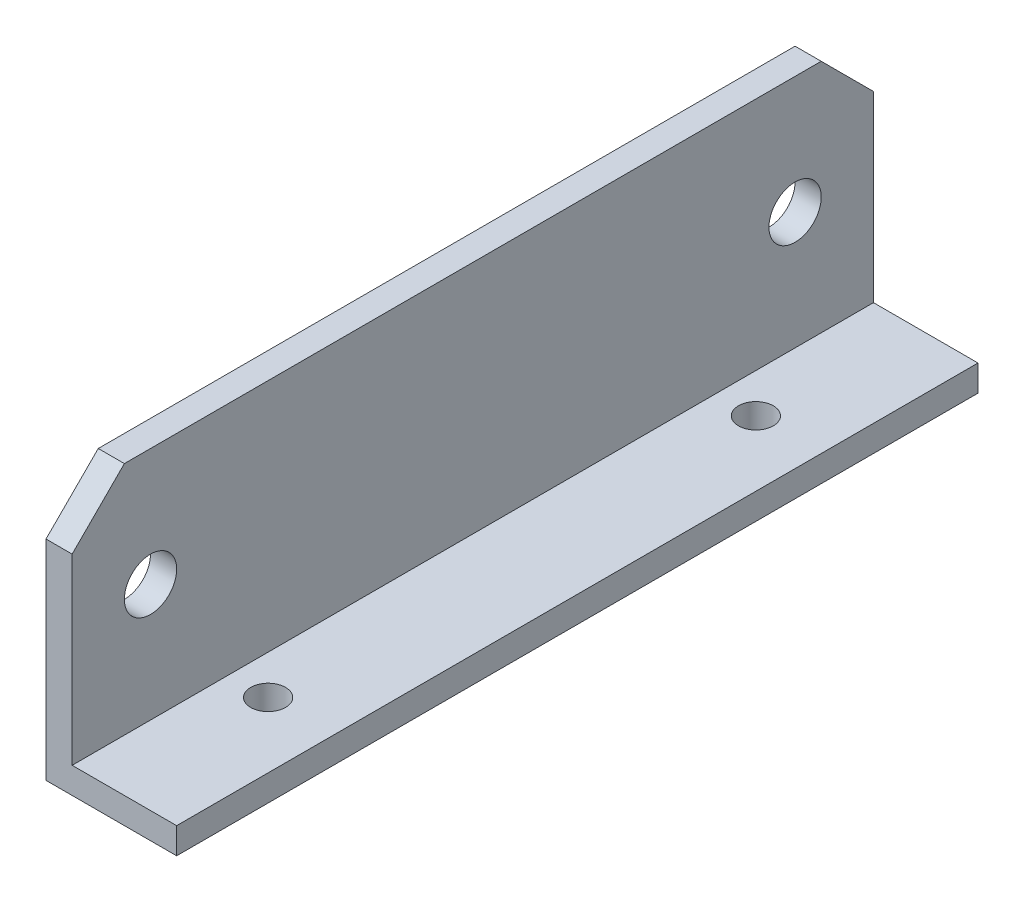
ISO-10303-21;
HEADER;
FILE_DESCRIPTION(('STEP AP214'),'2;1');
FILE_NAME('part.step','',(''),(''),'','','');
FILE_SCHEMA(('AUTOMOTIVE_DESIGN { 1 0 10303 214 1 1 1 1 }'));
ENDSEC;
DATA;
#1=APPLICATION_CONTEXT('core data for automotive mechanical design processes');
#2=APPLICATION_PROTOCOL_DEFINITION('international standard','automotive_design',2000,#1);
#3=PRODUCT_CONTEXT('',#1,'mechanical');
#4=PRODUCT('Part','Part','',(#3));
#5=PRODUCT_RELATED_PRODUCT_CATEGORY('part','',(#4));
#6=PRODUCT_DEFINITION_FORMATION('','',#4);
#7=PRODUCT_DEFINITION_CONTEXT('part definition',#1,'design');
#8=PRODUCT_DEFINITION('design','',#6,#7);
#9=PRODUCT_DEFINITION_SHAPE('','',#8);
#10=(LENGTH_UNIT() NAMED_UNIT(*) SI_UNIT(.MILLI.,.METRE.));
#11=(NAMED_UNIT(*) PLANE_ANGLE_UNIT() SI_UNIT($,.RADIAN.));
#12=(NAMED_UNIT(*) SI_UNIT($,.STERADIAN.) SOLID_ANGLE_UNIT());
#13=UNCERTAINTY_MEASURE_WITH_UNIT(LENGTH_MEASURE(1.E-05),#10,'distance_accuracy_value','');
#14=(GEOMETRIC_REPRESENTATION_CONTEXT(3) GLOBAL_UNCERTAINTY_ASSIGNED_CONTEXT((#13)) GLOBAL_UNIT_ASSIGNED_CONTEXT((#10,
#11,#12)) REPRESENTATION_CONTEXT('',''));
#15=CARTESIAN_POINT('',(0.,0.,0.));
#16=DIRECTION('',(0.,0.,1.));
#17=DIRECTION('',(1.,0.,0.));
#18=AXIS2_PLACEMENT_3D('',#15,#16,#17);
#19=CARTESIAN_POINT('',(1.5,0.,46.));
#20=DIRECTION('',(-1.,0.,0.));
#21=DIRECTION('',(0.,0.,1.));
#22=AXIS2_PLACEMENT_3D('',#19,#20,#21);
#23=PLANE('',#22);
#24=CARTESIAN_POINT('',(1.5,8.25,4.5));
#25=DIRECTION('',(-1.,0.,0.));
#26=DIRECTION('',(0.,0.,1.));
#27=AXIS2_PLACEMENT_3D('',#24,#25,#26);
#28=CIRCLE('',#27,1.5);
#29=CARTESIAN_POINT('',(1.5,8.25,6.00000000000001));
#30=VERTEX_POINT('',#29);
#31=EDGE_CURVE('E203',#30,#30,#28,.T.);
#32=ORIENTED_EDGE('',*,*,#31,.T.);
#33=EDGE_LOOP('',(#32));
#34=FACE_BOUND('',#33,.T.);
#35=CARTESIAN_POINT('',(1.5,8.25,41.5));
#36=DIRECTION('',(-1.,0.,0.));
#37=DIRECTION('',(0.,0.,1.));
#38=AXIS2_PLACEMENT_3D('',#35,#36,#37);
#39=CIRCLE('',#38,1.5);
#40=CARTESIAN_POINT('',(1.5,8.25,43.));
#41=VERTEX_POINT('',#40);
#42=EDGE_CURVE('E206',#41,#41,#39,.T.);
#43=ORIENTED_EDGE('',*,*,#42,.T.);
#44=EDGE_LOOP('',(#43));
#45=FACE_BOUND('',#44,.T.);
#46=DIRECTION('',(0.,0.,-1.));
#47=VECTOR('',#46,1.);
#48=CARTESIAN_POINT('',(1.5,15.,46.));
#49=LINE('',#48,#47);
#50=CARTESIAN_POINT('',(1.5,15.,43.));
#51=VERTEX_POINT('',#50);
#52=CARTESIAN_POINT('',(1.5,15.,3.));
#53=VERTEX_POINT('',#52);
#54=EDGE_CURVE('E118',#51,#53,#49,.T.);
#55=ORIENTED_EDGE('',*,*,#54,.F.);
#56=DIRECTION('',(0.,-0.707106781186548,0.707106781186547));
#57=VECTOR('',#56,1.);
#58=CARTESIAN_POINT('',(1.5,5.99999999999999,52.));
#59=LINE('',#58,#57);
#60=CARTESIAN_POINT('',(1.5,12.,46.));
#61=VERTEX_POINT('',#60);
#62=EDGE_CURVE('E100',#51,#61,#59,.T.);
#63=ORIENTED_EDGE('',*,*,#62,.T.);
#64=DIRECTION('',(0.,1.,0.));
#65=VECTOR('',#64,1.);
#66=CARTESIAN_POINT('',(1.5,0.,46.));
#67=LINE('',#66,#65);
#68=CARTESIAN_POINT('',(1.5,1.5,46.));
#69=VERTEX_POINT('',#68);
#70=EDGE_CURVE('E150',#69,#61,#67,.T.);
#71=ORIENTED_EDGE('',*,*,#70,.F.);
#72=DIRECTION('',(0.,0.,-1.));
#73=VECTOR('',#72,1.);
#74=CARTESIAN_POINT('',(1.5,1.5,46.));
#75=LINE('',#74,#73);
#76=CARTESIAN_POINT('',(1.5,1.5,0.));
#77=VERTEX_POINT('',#76);
#78=EDGE_CURVE('E151',#69,#77,#75,.T.);
#79=ORIENTED_EDGE('',*,*,#78,.T.);
#80=DIRECTION('',(0.,1.,0.));
#81=VECTOR('',#80,1.);
#82=CARTESIAN_POINT('',(1.5,0.,0.));
#83=LINE('',#82,#81);
#84=CARTESIAN_POINT('',(1.5,12.,0.));
#85=VERTEX_POINT('',#84);
#86=EDGE_CURVE('E139',#77,#85,#83,.T.);
#87=ORIENTED_EDGE('',*,*,#86,.T.);
#88=DIRECTION('',(0.,0.707106781186547,0.707106781186548));
#89=VECTOR('',#88,1.);
#90=CARTESIAN_POINT('',(1.5,29.,17.));
#91=LINE('',#90,#89);
#92=EDGE_CURVE('E56',#85,#53,#91,.T.);
#93=ORIENTED_EDGE('',*,*,#92,.T.);
#94=EDGE_LOOP('',(#55,#63,#71,#79,#87,#93));
#95=FACE_BOUND('',#94,.T.);
#96=ADVANCED_FACE('F35',(#34,#45,#95),#23,.F.);
#97=CARTESIAN_POINT('',(0.,15.,46.));
#98=DIRECTION('',(0.,1.,0.));
#99=DIRECTION('',(0.,0.,1.));
#100=AXIS2_PLACEMENT_3D('',#97,#98,#99);
#101=PLANE('',#100);
#102=DIRECTION('',(-1.,0.,0.));
#103=VECTOR('',#102,1.);
#104=CARTESIAN_POINT('',(7.5,15.,43.));
#105=LINE('',#104,#103);
#106=CARTESIAN_POINT('',(0.,15.,43.));
#107=VERTEX_POINT('',#106);
#108=EDGE_CURVE('E97',#51,#107,#105,.T.);
#109=ORIENTED_EDGE('',*,*,#108,.F.);
#110=ORIENTED_EDGE('',*,*,#54,.T.);
#111=DIRECTION('',(-1.,0.,0.));
#112=VECTOR('',#111,1.);
#113=CARTESIAN_POINT('',(7.5,15.,3.));
#114=LINE('',#113,#112);
#115=CARTESIAN_POINT('',(0.,15.,3.));
#116=VERTEX_POINT('',#115);
#117=EDGE_CURVE('E117',#53,#116,#114,.T.);
#118=ORIENTED_EDGE('',*,*,#117,.T.);
#119=DIRECTION('',(0.,0.,-1.));
#120=VECTOR('',#119,1.);
#121=CARTESIAN_POINT('',(0.,15.,46.));
#122=LINE('',#121,#120);
#123=EDGE_CURVE('E110',#107,#116,#122,.T.);
#124=ORIENTED_EDGE('',*,*,#123,.F.);
#125=EDGE_LOOP('',(#109,#110,#118,#124));
#126=FACE_BOUND('',#125,.T.);
#127=ADVANCED_FACE('F116',(#126),#101,.T.);
#128=CARTESIAN_POINT('',(0.,0.,46.));
#129=DIRECTION('',(-1.,0.,0.));
#130=DIRECTION('',(0.,0.,1.));
#131=AXIS2_PLACEMENT_3D('',#128,#129,#130);
#132=PLANE('',#131);
#133=DIRECTION('',(0.,-0.707106781186548,0.707106781186547));
#134=VECTOR('',#133,1.);
#135=CARTESIAN_POINT('',(0.,12.,46.));
#136=LINE('',#135,#134);
#137=CARTESIAN_POINT('',(0.,12.,46.));
#138=VERTEX_POINT('',#137);
#139=EDGE_CURVE('E49',#107,#138,#136,.T.);
#140=ORIENTED_EDGE('',*,*,#139,.F.);
#141=ORIENTED_EDGE('',*,*,#123,.T.);
#142=DIRECTION('',(0.,0.707106781186547,0.707106781186548));
#143=VECTOR('',#142,1.);
#144=CARTESIAN_POINT('',(0.,12.,0.));
#145=LINE('',#144,#143);
#146=CARTESIAN_POINT('',(0.,12.,0.));
#147=VERTEX_POINT('',#146);
#148=EDGE_CURVE('E126',#147,#116,#145,.T.);
#149=ORIENTED_EDGE('',*,*,#148,.F.);
#150=DIRECTION('',(0.,1.,0.));
#151=VECTOR('',#150,1.);
#152=CARTESIAN_POINT('',(0.,0.,0.));
#153=LINE('',#152,#151);
#154=CARTESIAN_POINT('',(0.,0.,0.));
#155=VERTEX_POINT('',#154);
#156=EDGE_CURVE('E132',#155,#147,#153,.T.);
#157=ORIENTED_EDGE('',*,*,#156,.F.);
#158=DIRECTION('',(0.,0.,-1.));
#159=VECTOR('',#158,1.);
#160=CARTESIAN_POINT('',(0.,0.,46.));
#161=LINE('',#160,#159);
#162=CARTESIAN_POINT('',(0.,0.,46.));
#163=VERTEX_POINT('',#162);
#164=EDGE_CURVE('E119',#163,#155,#161,.T.);
#165=ORIENTED_EDGE('',*,*,#164,.F.);
#166=DIRECTION('',(0.,1.,0.));
#167=VECTOR('',#166,1.);
#168=CARTESIAN_POINT('',(0.,0.,46.));
#169=LINE('',#168,#167);
#170=EDGE_CURVE('E113',#163,#138,#169,.T.);
#171=ORIENTED_EDGE('',*,*,#170,.T.);
#172=EDGE_LOOP('',(#140,#141,#149,#157,#165,#171));
#173=FACE_BOUND('',#172,.T.);
#174=CARTESIAN_POINT('',(0.,8.25,4.5));
#175=DIRECTION('',(-1.,0.,0.));
#176=DIRECTION('',(0.,0.,-1.));
#177=AXIS2_PLACEMENT_3D('',#174,#175,#176);
#178=CIRCLE('',#177,1.5);
#179=CARTESIAN_POINT('',(0.,8.25,3.));
#180=VERTEX_POINT('',#179);
#181=EDGE_CURVE('E337',#180,#180,#178,.T.);
#182=ORIENTED_EDGE('',*,*,#181,.F.);
#183=EDGE_LOOP('',(#182));
#184=FACE_BOUND('',#183,.T.);
#185=CARTESIAN_POINT('',(0.,8.25,41.5));
#186=DIRECTION('',(-1.,0.,0.));
#187=DIRECTION('',(0.,0.,1.));
#188=AXIS2_PLACEMENT_3D('',#185,#186,#187);
#189=CIRCLE('',#188,1.5);
#190=CARTESIAN_POINT('',(0.,8.25,43.));
#191=VERTEX_POINT('',#190);
#192=EDGE_CURVE('E209',#191,#191,#189,.T.);
#193=ORIENTED_EDGE('',*,*,#192,.F.);
#194=EDGE_LOOP('',(#193));
#195=FACE_BOUND('',#194,.T.);
#196=ADVANCED_FACE('F107',(#173,#184,#195),#132,.T.);
#197=CARTESIAN_POINT('',(0.,0.,46.));
#198=DIRECTION('',(0.,-1.,0.));
#199=DIRECTION('',(0.,0.,-1.));
#200=AXIS2_PLACEMENT_3D('',#197,#198,#199);
#201=PLANE('',#200);
#202=CARTESIAN_POINT('',(3.75,0.,37.));
#203=DIRECTION('',(0.,1.,0.));
#204=DIRECTION('',(0.,0.,-1.));
#205=AXIS2_PLACEMENT_3D('',#202,#203,#204);
#206=CIRCLE('',#205,1.);
#207=CARTESIAN_POINT('',(3.75,0.,36.));
#208=VERTEX_POINT('',#207);
#209=EDGE_CURVE('E212',#208,#208,#206,.T.);
#210=ORIENTED_EDGE('',*,*,#209,.T.);
#211=EDGE_LOOP('',(#210));
#212=FACE_BOUND('',#211,.T.);
#213=CARTESIAN_POINT('',(3.75,0.,9.));
#214=DIRECTION('',(0.,1.,0.));
#215=DIRECTION('',(0.,0.,1.));
#216=AXIS2_PLACEMENT_3D('',#213,#214,#215);
#217=CIRCLE('',#216,1.);
#218=CARTESIAN_POINT('',(3.75,0.,10.));
#219=VERTEX_POINT('',#218);
#220=EDGE_CURVE('E143',#219,#219,#217,.T.);
#221=ORIENTED_EDGE('',*,*,#220,.T.);
#222=EDGE_LOOP('',(#221));
#223=FACE_BOUND('',#222,.T.);
#224=DIRECTION('',(-1.,0.,0.));
#225=VECTOR('',#224,1.);
#226=CARTESIAN_POINT('',(0.,0.,0.));
#227=LINE('',#226,#225);
#228=CARTESIAN_POINT('',(7.5,0.,0.));
#229=VERTEX_POINT('',#228);
#230=EDGE_CURVE('E138',#229,#155,#227,.T.);
#231=ORIENTED_EDGE('',*,*,#230,.F.);
#232=DIRECTION('',(0.,0.,-1.));
#233=VECTOR('',#232,1.);
#234=CARTESIAN_POINT('',(7.5,0.,46.));
#235=LINE('',#234,#233);
#236=CARTESIAN_POINT('',(7.5,0.,46.));
#237=VERTEX_POINT('',#236);
#238=EDGE_CURVE('E122',#237,#229,#235,.T.);
#239=ORIENTED_EDGE('',*,*,#238,.F.);
#240=DIRECTION('',(-1.,0.,0.));
#241=VECTOR('',#240,1.);
#242=CARTESIAN_POINT('',(0.,0.,46.));
#243=LINE('',#242,#241);
#244=EDGE_CURVE('E176',#237,#163,#243,.T.);
#245=ORIENTED_EDGE('',*,*,#244,.T.);
#246=ORIENTED_EDGE('',*,*,#164,.T.);
#247=EDGE_LOOP('',(#231,#239,#245,#246));
#248=FACE_BOUND('',#247,.T.);
#249=ADVANCED_FACE('F165',(#212,#223,#248),#201,.T.);
#250=CARTESIAN_POINT('',(7.5,1.5,46.));
#251=DIRECTION('',(1.,0.,0.));
#252=DIRECTION('',(0.,0.,-1.));
#253=AXIS2_PLACEMENT_3D('',#250,#251,#252);
#254=PLANE('',#253);
#255=DIRECTION('',(0.,-1.,0.));
#256=VECTOR('',#255,1.);
#257=CARTESIAN_POINT('',(7.5,1.5,0.));
#258=LINE('',#257,#256);
#259=CARTESIAN_POINT('',(7.5,1.5,0.));
#260=VERTEX_POINT('',#259);
#261=EDGE_CURVE('E141',#260,#229,#258,.T.);
#262=ORIENTED_EDGE('',*,*,#261,.F.);
#263=DIRECTION('',(0.,0.,-1.));
#264=VECTOR('',#263,1.);
#265=CARTESIAN_POINT('',(7.5,1.5,46.));
#266=LINE('',#265,#264);
#267=CARTESIAN_POINT('',(7.5,1.5,46.));
#268=VERTEX_POINT('',#267);
#269=EDGE_CURVE('E154',#268,#260,#266,.T.);
#270=ORIENTED_EDGE('',*,*,#269,.F.);
#271=DIRECTION('',(0.,-1.,0.));
#272=VECTOR('',#271,1.);
#273=CARTESIAN_POINT('',(7.5,1.5,46.));
#274=LINE('',#273,#272);
#275=EDGE_CURVE('E161',#268,#237,#274,.T.);
#276=ORIENTED_EDGE('',*,*,#275,.T.);
#277=ORIENTED_EDGE('',*,*,#238,.T.);
#278=EDGE_LOOP('',(#262,#270,#276,#277));
#279=FACE_BOUND('',#278,.T.);
#280=ADVANCED_FACE('F159',(#279),#254,.T.);
#281=CARTESIAN_POINT('',(0.,1.5,46.));
#282=DIRECTION('',(0.,-1.,0.));
#283=DIRECTION('',(0.,0.,-1.));
#284=AXIS2_PLACEMENT_3D('',#281,#282,#283);
#285=PLANE('',#284);
#286=CARTESIAN_POINT('',(3.75,1.5,37.));
#287=DIRECTION('',(0.,1.,0.));
#288=DIRECTION('',(0.,0.,-1.));
#289=AXIS2_PLACEMENT_3D('',#286,#287,#288);
#290=CIRCLE('',#289,1.);
#291=CARTESIAN_POINT('',(3.75,1.5,36.));
#292=VERTEX_POINT('',#291);
#293=EDGE_CURVE('E208',#292,#292,#290,.T.);
#294=ORIENTED_EDGE('',*,*,#293,.F.);
#295=EDGE_LOOP('',(#294));
#296=FACE_BOUND('',#295,.T.);
#297=CARTESIAN_POINT('',(3.75,1.5,9.));
#298=DIRECTION('',(0.,1.,0.));
#299=DIRECTION('',(0.,0.,1.));
#300=AXIS2_PLACEMENT_3D('',#297,#298,#299);
#301=CIRCLE('',#300,1.);
#302=CARTESIAN_POINT('',(3.75,1.5,10.));
#303=VERTEX_POINT('',#302);
#304=EDGE_CURVE('E179',#303,#303,#301,.T.);
#305=ORIENTED_EDGE('',*,*,#304,.F.);
#306=EDGE_LOOP('',(#305));
#307=FACE_BOUND('',#306,.T.);
#308=DIRECTION('',(1.,0.,0.));
#309=VECTOR('',#308,1.);
#310=CARTESIAN_POINT('',(0.,1.5,0.));
#311=LINE('',#310,#309);
#312=EDGE_CURVE('E148',#260,#77,#311,.F.);
#313=ORIENTED_EDGE('',*,*,#312,.T.);
#314=ORIENTED_EDGE('',*,*,#78,.F.);
#315=DIRECTION('',(1.,0.,0.));
#316=VECTOR('',#315,1.);
#317=CARTESIAN_POINT('',(0.,1.5,46.));
#318=LINE('',#317,#316);
#319=EDGE_CURVE('E155',#268,#69,#318,.F.);
#320=ORIENTED_EDGE('',*,*,#319,.F.);
#321=ORIENTED_EDGE('',*,*,#269,.T.);
#322=EDGE_LOOP('',(#313,#314,#320,#321));
#323=FACE_BOUND('',#322,.T.);
#324=ADVANCED_FACE('F169',(#296,#307,#323),#285,.F.);
#325=CARTESIAN_POINT('',(0.,0.,46.));
#326=DIRECTION('',(0.,0.,-1.));
#327=DIRECTION('',(-1.,0.,0.));
#328=AXIS2_PLACEMENT_3D('',#325,#326,#327);
#329=PLANE('',#328);
#330=ORIENTED_EDGE('',*,*,#70,.T.);
#331=DIRECTION('',(-1.,0.,0.));
#332=VECTOR('',#331,1.);
#333=CARTESIAN_POINT('',(0.,12.,46.));
#334=LINE('',#333,#332);
#335=EDGE_CURVE('E11',#61,#138,#334,.T.);
#336=ORIENTED_EDGE('',*,*,#335,.T.);
#337=ORIENTED_EDGE('',*,*,#170,.F.);
#338=ORIENTED_EDGE('',*,*,#244,.F.);
#339=ORIENTED_EDGE('',*,*,#275,.F.);
#340=ORIENTED_EDGE('',*,*,#319,.T.);
#341=EDGE_LOOP('',(#330,#336,#337,#338,#339,#340));
#342=FACE_BOUND('',#341,.T.);
#343=ADVANCED_FACE('F183',(#342),#329,.F.);
#344=CARTESIAN_POINT('',(0.,0.,0.));
#345=DIRECTION('',(0.,0.,-1.));
#346=DIRECTION('',(-1.,0.,0.));
#347=AXIS2_PLACEMENT_3D('',#344,#345,#346);
#348=PLANE('',#347);
#349=DIRECTION('',(-1.,0.,0.));
#350=VECTOR('',#349,1.);
#351=CARTESIAN_POINT('',(0.,12.,0.));
#352=LINE('',#351,#350);
#353=EDGE_CURVE('E42',#85,#147,#352,.T.);
#354=ORIENTED_EDGE('',*,*,#353,.F.);
#355=ORIENTED_EDGE('',*,*,#86,.F.);
#356=ORIENTED_EDGE('',*,*,#312,.F.);
#357=ORIENTED_EDGE('',*,*,#261,.T.);
#358=ORIENTED_EDGE('',*,*,#230,.T.);
#359=ORIENTED_EDGE('',*,*,#156,.T.);
#360=EDGE_LOOP('',(#354,#355,#356,#357,#358,#359));
#361=FACE_BOUND('',#360,.T.);
#362=ADVANCED_FACE('F135',(#361),#348,.T.);
#363=CARTESIAN_POINT('',(3.75,0.,9.));
#364=DIRECTION('',(0.,1.,0.));
#365=DIRECTION('',(0.,0.,1.));
#366=AXIS2_PLACEMENT_3D('',#363,#364,#365);
#367=CYLINDRICAL_SURFACE('',#366,1.);
#368=ORIENTED_EDGE('',*,*,#220,.F.);
#369=EDGE_LOOP('',(#368));
#370=FACE_BOUND('',#369,.T.);
#371=ORIENTED_EDGE('',*,*,#304,.T.);
#372=EDGE_LOOP('',(#371));
#373=FACE_BOUND('',#372,.T.);
#374=ADVANCED_FACE('F190',(#370,#373),#367,.F.);
#375=CARTESIAN_POINT('',(3.75,0.,37.));
#376=DIRECTION('',(0.,1.,0.));
#377=DIRECTION('',(0.,0.,1.));
#378=AXIS2_PLACEMENT_3D('',#375,#376,#377);
#379=CYLINDRICAL_SURFACE('',#378,1.);
#380=ORIENTED_EDGE('',*,*,#209,.F.);
#381=EDGE_LOOP('',(#380));
#382=FACE_BOUND('',#381,.T.);
#383=ORIENTED_EDGE('',*,*,#293,.T.);
#384=EDGE_LOOP('',(#383));
#385=FACE_BOUND('',#384,.T.);
#386=ADVANCED_FACE('F227',(#382,#385),#379,.F.);
#387=CARTESIAN_POINT('',(7.5,8.25,41.5));
#388=DIRECTION('',(-1.,0.,0.));
#389=DIRECTION('',(0.,0.,1.));
#390=AXIS2_PLACEMENT_3D('',#387,#388,#389);
#391=CYLINDRICAL_SURFACE('',#390,1.5);
#392=ORIENTED_EDGE('',*,*,#192,.T.);
#393=EDGE_LOOP('',(#392));
#394=FACE_BOUND('',#393,.T.);
#395=ORIENTED_EDGE('',*,*,#42,.F.);
#396=EDGE_LOOP('',(#395));
#397=FACE_BOUND('',#396,.T.);
#398=ADVANCED_FACE('F232',(#394,#397),#391,.F.);
#399=CARTESIAN_POINT('',(7.5,8.25,4.5));
#400=DIRECTION('',(-1.,0.,0.));
#401=DIRECTION('',(0.,0.,1.));
#402=AXIS2_PLACEMENT_3D('',#399,#400,#401);
#403=CYLINDRICAL_SURFACE('',#402,1.5);
#404=ORIENTED_EDGE('',*,*,#181,.T.);
#405=EDGE_LOOP('',(#404));
#406=FACE_BOUND('',#405,.T.);
#407=ORIENTED_EDGE('',*,*,#31,.F.);
#408=EDGE_LOOP('',(#407));
#409=FACE_BOUND('',#408,.T.);
#410=ADVANCED_FACE('F238',(#406,#409),#403,.F.);
#411=CARTESIAN_POINT('',(7.5,12.,0.));
#412=DIRECTION('',(0.,-0.707106781186548,0.707106781186547));
#413=DIRECTION('',(0.,-0.707106781186547,-0.707106781186548));
#414=AXIS2_PLACEMENT_3D('',#411,#412,#413);
#415=PLANE('',#414);
#416=ORIENTED_EDGE('',*,*,#353,.T.);
#417=ORIENTED_EDGE('',*,*,#148,.T.);
#418=ORIENTED_EDGE('',*,*,#117,.F.);
#419=ORIENTED_EDGE('',*,*,#92,.F.);
#420=EDGE_LOOP('',(#416,#417,#418,#419));
#421=FACE_BOUND('',#420,.T.);
#422=ADVANCED_FACE('F125',(#421),#415,.F.);
#423=CARTESIAN_POINT('',(7.5,12.,46.));
#424=DIRECTION('',(0.,-0.707106781186547,-0.707106781186548));
#425=DIRECTION('',(0.,0.707106781186548,-0.707106781186547));
#426=AXIS2_PLACEMENT_3D('',#423,#424,#425);
#427=PLANE('',#426);
#428=ORIENTED_EDGE('',*,*,#108,.T.);
#429=ORIENTED_EDGE('',*,*,#139,.T.);
#430=ORIENTED_EDGE('',*,*,#335,.F.);
#431=ORIENTED_EDGE('',*,*,#62,.F.);
#432=EDGE_LOOP('',(#428,#429,#430,#431));
#433=FACE_BOUND('',#432,.T.);
#434=ADVANCED_FACE('F98',(#433),#427,.F.);
#435=CLOSED_SHELL('',(#96,#127,#196,#249,#280,#324,#343,#362,#374,#386,#398,#410,#422,#434));
#436=MANIFOLD_SOLID_BREP('B2',#435);
#437=ADVANCED_BREP_SHAPE_REPRESENTATION('',(#18,#436),#14);
#438=SHAPE_DEFINITION_REPRESENTATION(#9,#437);
ENDSEC;
END-ISO-10303-21;
